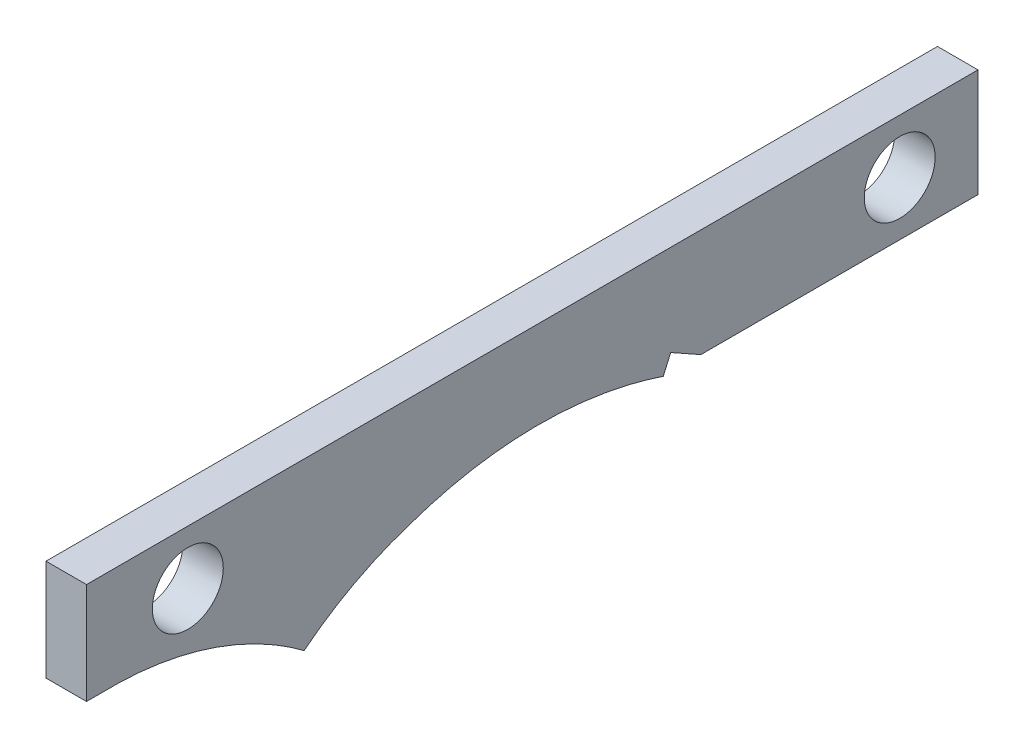
ISO-10303-21;
HEADER;
FILE_DESCRIPTION(('STEP AP214'),'2;1');
FILE_NAME('part.step','',(''),(''),'','','');
FILE_SCHEMA(('AUTOMOTIVE_DESIGN { 1 0 10303 214 1 1 1 1 }'));
ENDSEC;
DATA;
#1=APPLICATION_CONTEXT('core data for automotive mechanical design processes');
#2=APPLICATION_PROTOCOL_DEFINITION('international standard','automotive_design',2000,#1);
#3=PRODUCT_CONTEXT('',#1,'mechanical');
#4=PRODUCT('Part','Part','',(#3));
#5=PRODUCT_RELATED_PRODUCT_CATEGORY('part','',(#4));
#6=PRODUCT_DEFINITION_FORMATION('','',#4);
#7=PRODUCT_DEFINITION_CONTEXT('part definition',#1,'design');
#8=PRODUCT_DEFINITION('design','',#6,#7);
#9=PRODUCT_DEFINITION_SHAPE('','',#8);
#10=(LENGTH_UNIT() NAMED_UNIT(*) SI_UNIT(.MILLI.,.METRE.));
#11=(NAMED_UNIT(*) PLANE_ANGLE_UNIT() SI_UNIT($,.RADIAN.));
#12=(NAMED_UNIT(*) SI_UNIT($,.STERADIAN.) SOLID_ANGLE_UNIT());
#13=UNCERTAINTY_MEASURE_WITH_UNIT(LENGTH_MEASURE(1.E-05),#10,'distance_accuracy_value','');
#14=(GEOMETRIC_REPRESENTATION_CONTEXT(3) GLOBAL_UNCERTAINTY_ASSIGNED_CONTEXT((#13)) GLOBAL_UNIT_ASSIGNED_CONTEXT((#10,
#11,#12)) REPRESENTATION_CONTEXT('',''));
#15=CARTESIAN_POINT('',(0.,0.,0.));
#16=DIRECTION('',(0.,0.,1.));
#17=DIRECTION('',(1.,0.,0.));
#18=AXIS2_PLACEMENT_3D('',#15,#16,#17);
#19=CARTESIAN_POINT('',(-310.5,185.,219.999999999998));
#20=CARTESIAN_POINT('',(-310.5,184.50816695374,204.877009792477));
#21=CARTESIAN_POINT('',(-310.5,175.418459021161,192.780566420039));
#22=CARTESIAN_POINT('',(-316.5,185.,219.999999999998));
#23=CARTESIAN_POINT('',(-316.5,184.50816695374,204.877009792477));
#24=CARTESIAN_POINT('',(-316.5,175.418459021161,192.780566420039));
#25=(BOUNDED_SURFACE() B_SPLINE_SURFACE(1,2,((#19,#20,#21),(#22,#23,#24)),.UNSPECIFIED.,.F.,.F.,
.F.) B_SPLINE_SURFACE_WITH_KNOTS((2,2),(3,3),(0.0626276430115544,0.187882929034663),
(0.0325107499581212,0.644419774946387),
.UNSPECIFIED.) GEOMETRIC_REPRESENTATION_ITEM() RATIONAL_B_SPLINE_SURFACE(((1.,0.953559884501479,
1.),(1.,0.953559884501479,1.))) REPRESENTATION_ITEM('') SURFACE());
#26=CARTESIAN_POINT('',(-310.5,185.,219.999999999998));
#27=CARTESIAN_POINT('',(-310.5,184.50816695374,204.877009792477));
#28=CARTESIAN_POINT('',(-310.5,175.418459021161,192.780566420039));
#29=(BOUNDED_CURVE() B_SPLINE_CURVE(2,(#26,#27,#28),.UNSPECIFIED.,.F.,
.F.) B_SPLINE_CURVE_WITH_KNOTS((3,3),(0.0325107499581212,0.644419774946387),
.UNSPECIFIED.) CURVE() GEOMETRIC_REPRESENTATION_ITEM() RATIONAL_B_SPLINE_CURVE((1.,
0.953559884501481,1.)) REPRESENTATION_ITEM(''));
#30=CARTESIAN_POINT('',(-310.5,185.,219.999999999998));
#31=VERTEX_POINT('',#30);
#32=CARTESIAN_POINT('',(-310.5,175.418459021161,192.780566420039));
#33=VERTEX_POINT('',#32);
#34=EDGE_CURVE('E38',#31,#33,#29,.T.);
#35=CARTESIAN_POINT('',(-310.5,185.,219.999999999998));
#36=CARTESIAN_POINT('',(-316.5,185.,219.999999999998));
#37=(BOUNDED_CURVE() B_SPLINE_CURVE(1,(#35,#36),.UNSPECIFIED.,.F.,
.F.) B_SPLINE_CURVE_WITH_KNOTS((2,2),(-0.1,0.5),
.UNSPECIFIED.) CURVE() GEOMETRIC_REPRESENTATION_ITEM() RATIONAL_B_SPLINE_CURVE((1.,1.)) REPRESENTATION_ITEM(''));
#38=CARTESIAN_POINT('',(-316.5,185.,219.999999999998));
#39=VERTEX_POINT('',#38);
#40=EDGE_CURVE('E11',#31,#39,#37,.T.);
#41=CARTESIAN_POINT('',(-316.5,175.418459021161,192.780566420039));
#42=CARTESIAN_POINT('',(-316.5,184.50816695374,204.877009792477));
#43=CARTESIAN_POINT('',(-316.5,185.,219.999999999998));
#44=(BOUNDED_CURVE() B_SPLINE_CURVE(2,(#41,#42,#43),.UNSPECIFIED.,.F.,
.F.) B_SPLINE_CURVE_WITH_KNOTS((3,3),(-0.644419774946387,-0.0325107499581212),
.UNSPECIFIED.) CURVE() GEOMETRIC_REPRESENTATION_ITEM() RATIONAL_B_SPLINE_CURVE((1.,
0.953559884501481,1.)) REPRESENTATION_ITEM(''));
#45=CARTESIAN_POINT('',(-316.5,175.418459021161,192.780566420039));
#46=VERTEX_POINT('',#45);
#47=EDGE_CURVE('E143',#46,#39,#44,.T.);
#48=CARTESIAN_POINT('',(-310.5,175.418459021161,192.780566420039));
#49=CARTESIAN_POINT('',(-316.5,175.418459021161,192.780566420039));
#50=(BOUNDED_CURVE() B_SPLINE_CURVE(1,(#48,#49),.UNSPECIFIED.,.F.,
.F.) B_SPLINE_CURVE_WITH_KNOTS((2,2),(0.3,0.9),
.UNSPECIFIED.) CURVE() GEOMETRIC_REPRESENTATION_ITEM() RATIONAL_B_SPLINE_CURVE((1.,1.)) REPRESENTATION_ITEM(''));
#51=EDGE_CURVE('E31',#33,#46,#50,.T.);
#52=ORIENTED_EDGE('',*,*,#34,.F.);
#53=ORIENTED_EDGE('',*,*,#40,.T.);
#54=ORIENTED_EDGE('',*,*,#47,.F.);
#55=ORIENTED_EDGE('',*,*,#51,.F.);
#56=EDGE_LOOP('',(#52,#53,#54,#55));
#57=FACE_BOUND('',#56,.T.);
#58=ADVANCED_FACE('F16',(#57),#25,.T.);
#59=CARTESIAN_POINT('',(-316.5,183.736343401191,177.248420365533));
#60=CARTESIAN_POINT('',(-316.5,181.000038118032,185.776353940869));
#61=CARTESIAN_POINT('',(-316.5,175.418459021161,192.780566420039));
#62=CARTESIAN_POINT('',(-310.5,183.736343401191,177.248420365533));
#63=CARTESIAN_POINT('',(-310.5,181.000038118032,185.776353940869));
#64=CARTESIAN_POINT('',(-310.5,175.418459021161,192.780566420039));
#65=(BOUNDED_SURFACE() B_SPLINE_SURFACE(1,2,((#59,#60,#61),(#62,#63,#64)),.UNSPECIFIED.,.F.,.F.,
.F.) B_SPLINE_SURFACE_WITH_KNOTS((2,2),(3,3),(0.,0.122721717320036),(-0.390907154968764,
-0.028552435822604),
.UNSPECIFIED.) GEOMETRIC_REPRESENTATION_ITEM() RATIONAL_B_SPLINE_SURFACE(((1.,0.983632228764717,
1.),(1.,0.983632228764717,1.))) REPRESENTATION_ITEM('') SURFACE());
#66=CARTESIAN_POINT('',(-316.5,183.73634340119,177.248420365535));
#67=CARTESIAN_POINT('',(-316.5,181.000038118031,185.77635394087));
#68=CARTESIAN_POINT('',(-316.5,175.418459021161,192.780566420039));
#69=(BOUNDED_CURVE() B_SPLINE_CURVE(2,(#66,#67,#68),.UNSPECIFIED.,.F.,
.F.) B_SPLINE_CURVE_WITH_KNOTS((3,3),(-0.390907154968713,-0.0285524358226042),
.UNSPECIFIED.) CURVE() GEOMETRIC_REPRESENTATION_ITEM() RATIONAL_B_SPLINE_CURVE((1.,
0.983632228764737,1.)) REPRESENTATION_ITEM(''));
#70=CARTESIAN_POINT('',(-316.5,183.73634340119,177.248420365535));
#71=VERTEX_POINT('',#70);
#72=EDGE_CURVE('E133',#71,#46,#69,.T.);
#73=CARTESIAN_POINT('',(-316.5,183.736343401191,177.248420365533));
#74=CARTESIAN_POINT('',(-310.5,183.736343401191,177.248420365533));
#75=(BOUNDED_CURVE() B_SPLINE_CURVE(1,(#73,#74),.UNSPECIFIED.,.F.,
.F.) B_SPLINE_CURVE_WITH_KNOTS((2,2),(0.,0.6),
.UNSPECIFIED.) CURVE() GEOMETRIC_REPRESENTATION_ITEM() RATIONAL_B_SPLINE_CURVE((1.,1.)) REPRESENTATION_ITEM(''));
#76=CARTESIAN_POINT('',(-310.5,183.736343401191,177.248420365533));
#77=VERTEX_POINT('',#76);
#78=EDGE_CURVE('E145',#71,#77,#75,.T.);
#79=CARTESIAN_POINT('',(-310.5,175.418459021161,192.780566420039));
#80=CARTESIAN_POINT('',(-310.5,181.000038118032,185.776353940869));
#81=CARTESIAN_POINT('',(-310.5,183.736343401191,177.248420365533));
#82=(BOUNDED_CURVE() B_SPLINE_CURVE(2,(#79,#80,#81),.UNSPECIFIED.,.F.,
.F.) B_SPLINE_CURVE_WITH_KNOTS((3,3),(0.0285524358226042,0.390907154968764),
.UNSPECIFIED.) CURVE() GEOMETRIC_REPRESENTATION_ITEM() RATIONAL_B_SPLINE_CURVE((1.,
0.983632228764721,1.)) REPRESENTATION_ITEM(''));
#83=EDGE_CURVE('E126',#33,#77,#82,.T.);
#84=ORIENTED_EDGE('',*,*,#51,.T.);
#85=ORIENTED_EDGE('',*,*,#72,.F.);
#86=ORIENTED_EDGE('',*,*,#78,.T.);
#87=ORIENTED_EDGE('',*,*,#83,.F.);
#88=EDGE_LOOP('',(#84,#85,#86,#87));
#89=FACE_BOUND('',#88,.T.);
#90=ADVANCED_FACE('F147',(#89),#65,.T.);
#91=CARTESIAN_POINT('',(-316.51,185.,219.989999999998));
#92=CARTESIAN_POINT('',(-316.51,185.,225.009999999998));
#93=CARTESIAN_POINT('',(-310.49,185.,219.989999999998));
#94=CARTESIAN_POINT('',(-310.49,185.,225.009999999998));
#95=(BOUNDED_SURFACE() B_SPLINE_SURFACE(1,1,((#91,#92),(#93,#94)),.UNSPECIFIED.,.F.,.F.,
.F.) B_SPLINE_SURFACE_WITH_KNOTS((2,2),(2,2),(-0.001,0.601),(-0.001,0.501),
.UNSPECIFIED.) GEOMETRIC_REPRESENTATION_ITEM() RATIONAL_B_SPLINE_SURFACE(((1.,1.),(1.,1.))) REPRESENTATION_ITEM('') SURFACE());
#96=CARTESIAN_POINT('',(-316.5,185.,219.999999999998));
#97=CARTESIAN_POINT('',(-316.5,185.,224.999999999998));
#98=(BOUNDED_CURVE() B_SPLINE_CURVE(1,(#96,#97),.UNSPECIFIED.,.F.,
.F.) B_SPLINE_CURVE_WITH_KNOTS((2,2),(0.,0.5),
.UNSPECIFIED.) CURVE() GEOMETRIC_REPRESENTATION_ITEM() RATIONAL_B_SPLINE_CURVE((1.,1.)) REPRESENTATION_ITEM(''));
#99=CARTESIAN_POINT('',(-316.5,185.,224.999999999998));
#100=VERTEX_POINT('',#99);
#101=EDGE_CURVE('E172',#39,#100,#98,.T.);
#102=CARTESIAN_POINT('',(-310.5,185.,219.999999999998));
#103=CARTESIAN_POINT('',(-310.5,185.,224.999999999998));
#104=(BOUNDED_CURVE() B_SPLINE_CURVE(1,(#102,#103),.UNSPECIFIED.,.F.,
.F.) B_SPLINE_CURVE_WITH_KNOTS((2,2),(2.99999999999992,3.49999999999992),
.UNSPECIFIED.) CURVE() GEOMETRIC_REPRESENTATION_ITEM() RATIONAL_B_SPLINE_CURVE((1.,1.)) REPRESENTATION_ITEM(''));
#105=CARTESIAN_POINT('',(-310.5,185.,224.999999999998));
#106=VERTEX_POINT('',#105);
#107=EDGE_CURVE('E139',#31,#106,#104,.T.);
#108=CARTESIAN_POINT('',(-316.5,185.,224.999999999998));
#109=CARTESIAN_POINT('',(-310.5,185.,224.999999999998));
#110=(BOUNDED_CURVE() B_SPLINE_CURVE(1,(#108,#109),.UNSPECIFIED.,.F.,
.F.) B_SPLINE_CURVE_WITH_KNOTS((2,2),(-0.25,0.35),
.UNSPECIFIED.) CURVE() GEOMETRIC_REPRESENTATION_ITEM() RATIONAL_B_SPLINE_CURVE((1.,1.)) REPRESENTATION_ITEM(''));
#111=EDGE_CURVE('E240',#100,#106,#110,.T.);
#112=ORIENTED_EDGE('',*,*,#101,.F.);
#113=ORIENTED_EDGE('',*,*,#40,.F.);
#114=ORIENTED_EDGE('',*,*,#107,.T.);
#115=ORIENTED_EDGE('',*,*,#111,.F.);
#116=EDGE_LOOP('',(#112,#113,#114,#115));
#117=FACE_BOUND('',#116,.T.);
#118=ADVANCED_FACE('F410',(#117),#95,.T.);
#119=CARTESIAN_POINT('',(-310.49,184.99,224.999999999998));
#120=CARTESIAN_POINT('',(-316.51,184.99,224.999999999998));
#121=CARTESIAN_POINT('',(-310.49,200.01,224.999999999998));
#122=CARTESIAN_POINT('',(-316.51,200.01,224.999999999998));
#123=(BOUNDED_SURFACE() B_SPLINE_SURFACE(1,1,((#119,#120),(#121,#122)),.UNSPECIFIED.,.F.,.F.,
.F.) B_SPLINE_SURFACE_WITH_KNOTS((2,2),(2,2),(-0.00100000000000044,1.501),(-0.101,0.501),
.UNSPECIFIED.) GEOMETRIC_REPRESENTATION_ITEM() RATIONAL_B_SPLINE_SURFACE(((1.,1.),(1.,1.))) REPRESENTATION_ITEM('') SURFACE());
#124=CARTESIAN_POINT('',(-310.5,185.,224.999999999998));
#125=CARTESIAN_POINT('',(-310.5,200.,224.999999999998));
#126=(BOUNDED_CURVE() B_SPLINE_CURVE(1,(#124,#125),.UNSPECIFIED.,.F.,
.F.) B_SPLINE_CURVE_WITH_KNOTS((2,2),(2.59999999999992,4.09999999999992),
.UNSPECIFIED.) CURVE() GEOMETRIC_REPRESENTATION_ITEM() RATIONAL_B_SPLINE_CURVE((1.,1.)) REPRESENTATION_ITEM(''));
#127=CARTESIAN_POINT('',(-310.5,200.,224.999999999998));
#128=VERTEX_POINT('',#127);
#129=EDGE_CURVE('E231',#106,#128,#126,.T.);
#130=CARTESIAN_POINT('',(-310.5,200.,224.999999999998));
#131=CARTESIAN_POINT('',(-316.5,200.,224.999999999998));
#132=(BOUNDED_CURVE() B_SPLINE_CURVE(1,(#130,#131),.UNSPECIFIED.,.F.,
.F.) B_SPLINE_CURVE_WITH_KNOTS((2,2),(-0.1,0.5),
.UNSPECIFIED.) CURVE() GEOMETRIC_REPRESENTATION_ITEM() RATIONAL_B_SPLINE_CURVE((1.,1.)) REPRESENTATION_ITEM(''));
#133=CARTESIAN_POINT('',(-316.5,200.,224.999999999998));
#134=VERTEX_POINT('',#133);
#135=EDGE_CURVE('E241',#128,#134,#132,.T.);
#136=CARTESIAN_POINT('',(-316.5,200.,224.999999999998));
#137=CARTESIAN_POINT('',(-316.5,185.,224.999999999998));
#138=(BOUNDED_CURVE() B_SPLINE_CURVE(1,(#136,#137),.UNSPECIFIED.,.F.,
.F.) B_SPLINE_CURVE_WITH_KNOTS((2,2),(-4.09999999999992,-2.59999999999992),
.UNSPECIFIED.) CURVE() GEOMETRIC_REPRESENTATION_ITEM() RATIONAL_B_SPLINE_CURVE((1.,1.)) REPRESENTATION_ITEM(''));
#139=EDGE_CURVE('E353',#134,#100,#138,.T.);
#140=ORIENTED_EDGE('',*,*,#111,.T.);
#141=ORIENTED_EDGE('',*,*,#129,.T.);
#142=ORIENTED_EDGE('',*,*,#135,.T.);
#143=ORIENTED_EDGE('',*,*,#139,.T.);
#144=EDGE_LOOP('',(#140,#141,#142,#143));
#145=FACE_BOUND('',#144,.T.);
#146=ADVANCED_FACE('F407',(#145),#123,.T.);
#147=CARTESIAN_POINT('',(-316.5,175.40845902116,225.009999999998));
#148=CARTESIAN_POINT('',(-316.5,175.40845902116,92.9900013881491));
#149=CARTESIAN_POINT('',(-316.5,200.01,225.009999999998));
#150=CARTESIAN_POINT('',(-316.5,200.01,92.9900013881491));
#151=(BOUNDED_SURFACE() B_SPLINE_SURFACE(1,1,((#147,#148),(#149,#150)),.UNSPECIFIED.,.F.,.F.,
.F.) B_SPLINE_SURFACE_WITH_KNOTS((2,2),(2,2),(4.24084590211586,6.70099999999984),
(-6.50099999999984,6.70099986118509),
.UNSPECIFIED.) GEOMETRIC_REPRESENTATION_ITEM() RATIONAL_B_SPLINE_SURFACE(((1.,1.),(1.,1.))) REPRESENTATION_ITEM('') SURFACE());
#152=CARTESIAN_POINT('',(-316.5,200.,93.0000013881491));
#153=CARTESIAN_POINT('',(-316.5,200.,224.999999999998));
#154=(BOUNDED_CURVE() B_SPLINE_CURVE(1,(#152,#153),.UNSPECIFIED.,.F.,
.F.) B_SPLINE_CURVE_WITH_KNOTS((2,2),(-12.6999998611849,0.5),
.UNSPECIFIED.) CURVE() GEOMETRIC_REPRESENTATION_ITEM() RATIONAL_B_SPLINE_CURVE((1.,1.)) REPRESENTATION_ITEM(''));
#155=CARTESIAN_POINT('',(-316.5,200.,93.0000013881491));
#156=VERTEX_POINT('',#155);
#157=EDGE_CURVE('E853',#156,#134,#154,.T.);
#158=CARTESIAN_POINT('',(-316.5,200.,93.0000013881491));
#159=CARTESIAN_POINT('',(-316.5,184.000002920505,93.0000013881491));
#160=(BOUNDED_CURVE() B_SPLINE_CURVE(1,(#158,#159),.UNSPECIFIED.,.F.,
.F.) B_SPLINE_CURVE_WITH_KNOTS((2,2),(-3.69999999999992,-2.10000029205044),
.UNSPECIFIED.) CURVE() GEOMETRIC_REPRESENTATION_ITEM() RATIONAL_B_SPLINE_CURVE((1.,1.)) REPRESENTATION_ITEM(''));
#161=CARTESIAN_POINT('',(-316.5,184.000002920505,93.0000013881491));
#162=VERTEX_POINT('',#161);
#163=EDGE_CURVE('E181',#156,#162,#160,.T.);
#164=CARTESIAN_POINT('',(-316.5,184.000002920505,93.0000013881491));
#165=CARTESIAN_POINT('',(-316.5,184.000002920505,134.029375206115));
#166=(BOUNDED_CURVE() B_SPLINE_CURVE(1,(#164,#165),.UNSPECIFIED.,.F.,
.F.) B_SPLINE_CURVE_WITH_KNOTS((2,2),(-6.30597127861743,-2.20303389682083),
.UNSPECIFIED.) CURVE() GEOMETRIC_REPRESENTATION_ITEM() RATIONAL_B_SPLINE_CURVE((1.,1.)) REPRESENTATION_ITEM(''));
#167=CARTESIAN_POINT('',(-316.5,184.000002920505,134.029375206115));
#168=VERTEX_POINT('',#167);
#169=EDGE_CURVE('E57',#162,#168,#166,.T.);
#170=CARTESIAN_POINT('',(-316.5,184.000002920505,134.029375206115));
#171=CARTESIAN_POINT('',(-316.5,186.499999798834,138.499999679625));
#172=(BOUNDED_CURVE() B_SPLINE_CURVE(1,(#170,#171),.UNSPECIFIED.,.F.,
.F.) B_SPLINE_CURVE_WITH_KNOTS((2,2),(0.111231876302695,0.623447334628603),
.UNSPECIFIED.) CURVE() GEOMETRIC_REPRESENTATION_ITEM() RATIONAL_B_SPLINE_CURVE((1.,1.)) REPRESENTATION_ITEM(''));
#173=CARTESIAN_POINT('',(-316.5,186.499999798834,138.499999679625));
#174=VERTEX_POINT('',#173);
#175=EDGE_CURVE('E67',#168,#174,#172,.T.);
#176=CARTESIAN_POINT('',(-316.5,186.499999798834,138.499999679625));
#177=CARTESIAN_POINT('',(-316.5,184.000002920504,139.600149064627));
#178=(BOUNDED_CURVE() B_SPLINE_CURVE(1,(#176,#177),.UNSPECIFIED.,.F.,
.F.) B_SPLINE_CURVE_WITH_KNOTS((2,2),(-2.88140699886481,-2.60827126226155),
.UNSPECIFIED.) CURVE() GEOMETRIC_REPRESENTATION_ITEM() RATIONAL_B_SPLINE_CURVE((1.,1.)) REPRESENTATION_ITEM(''));
#179=CARTESIAN_POINT('',(-316.5,184.000002920504,139.600149064627));
#180=VERTEX_POINT('',#179);
#181=EDGE_CURVE('E344',#174,#180,#178,.T.);
#182=CARTESIAN_POINT('',(-316.5,184.000002920504,139.600149064627));
#183=CARTESIAN_POINT('',(-316.5,190.383345303281,158.469911966903));
#184=CARTESIAN_POINT('',(-316.5,183.73634340119,177.248420365535));
#185=(BOUNDED_CURVE() B_SPLINE_CURVE(2,(#182,#183,#184),.UNSPECIFIED.,.F.,
.F.) B_SPLINE_CURVE_WITH_KNOTS((3,3),(-0.997873568667045,-0.331467968237713),
.UNSPECIFIED.) CURVE() GEOMETRIC_REPRESENTATION_ITEM() RATIONAL_B_SPLINE_CURVE((1.,
0.944999648008286,1.)) REPRESENTATION_ITEM(''));
#186=EDGE_CURVE('E79',#180,#71,#185,.T.);
#187=CARTESIAN_POINT('',(-316.5,186.750000000002,104.591492462718));
#188=CARTESIAN_POINT('',(-316.5,186.750000000002,99.3414924627182));
#189=CARTESIAN_POINT('',(-316.5,192.000000000002,99.3414924627182));
#190=CARTESIAN_POINT('',(-316.5,197.250000000002,99.3414924627182));
#191=CARTESIAN_POINT('',(-316.5,197.250000000002,104.591492462718));
#192=CARTESIAN_POINT('',(-316.5,197.250000000002,109.841492462718));
#193=CARTESIAN_POINT('',(-316.5,192.000000000002,109.841492462718));
#194=CARTESIAN_POINT('',(-316.5,186.750000000002,109.841492462718));
#195=CARTESIAN_POINT('',(-316.5,186.750000000002,104.591492462718));
#196=(BOUNDED_CURVE() B_SPLINE_CURVE(2,(#187,#188,#189,#190,#191,#192,#193,#194,#195),
.UNSPECIFIED.,.T.,.F.) B_SPLINE_CURVE_WITH_KNOTS((3,2,2,2,3),(-3.14159265358979,
-1.5707963267949,0.,1.5707963267949,3.14159265358979),
.UNSPECIFIED.) CURVE() GEOMETRIC_REPRESENTATION_ITEM() RATIONAL_B_SPLINE_CURVE((1.,
0.707106781186546,1.,0.707106781186547,1.,0.707106781186547,1.,0.707106781186546,1.)) REPRESENTATION_ITEM(''));
#197=CARTESIAN_POINT('',(-316.5,186.750000000002,104.591492462718));
#198=VERTEX_POINT('',#197);
#199=EDGE_CURVE('E88',#198,#198,#196,.T.);
#200=CARTESIAN_POINT('',(-316.5,186.750000000002,210.));
#201=CARTESIAN_POINT('',(-316.5,186.750000000002,204.75));
#202=CARTESIAN_POINT('',(-316.5,192.000000000002,204.75));
#203=CARTESIAN_POINT('',(-316.5,197.250000000002,204.75));
#204=CARTESIAN_POINT('',(-316.5,197.250000000002,210.));
#205=CARTESIAN_POINT('',(-316.5,197.250000000002,215.25));
#206=CARTESIAN_POINT('',(-316.5,192.000000000002,215.25));
#207=CARTESIAN_POINT('',(-316.5,186.750000000002,215.25));
#208=CARTESIAN_POINT('',(-316.5,186.750000000002,210.));
#209=(BOUNDED_CURVE() B_SPLINE_CURVE(2,(#200,#201,#202,#203,#204,#205,#206,#207,#208),
.UNSPECIFIED.,.T.,.F.) B_SPLINE_CURVE_WITH_KNOTS((3,2,2,2,3),(-3.14159265358979,
-1.5707963267949,0.,1.5707963267949,3.14159265358979),
.UNSPECIFIED.) CURVE() GEOMETRIC_REPRESENTATION_ITEM() RATIONAL_B_SPLINE_CURVE((1.,
0.707106781186547,1.,0.707106781186547,1.,0.707106781186547,1.,0.707106781186547,1.)) REPRESENTATION_ITEM(''));
#210=CARTESIAN_POINT('',(-316.5,186.750000000002,210.));
#211=VERTEX_POINT('',#210);
#212=EDGE_CURVE('E162',#211,#211,#209,.T.);
#213=ORIENTED_EDGE('',*,*,#47,.T.);
#214=ORIENTED_EDGE('',*,*,#101,.T.);
#215=ORIENTED_EDGE('',*,*,#139,.F.);
#216=ORIENTED_EDGE('',*,*,#157,.F.);
#217=ORIENTED_EDGE('',*,*,#163,.T.);
#218=ORIENTED_EDGE('',*,*,#169,.T.);
#219=ORIENTED_EDGE('',*,*,#175,.T.);
#220=ORIENTED_EDGE('',*,*,#181,.T.);
#221=ORIENTED_EDGE('',*,*,#186,.T.);
#222=ORIENTED_EDGE('',*,*,#72,.T.);
#223=EDGE_LOOP('',(#213,#214,#215,#216,#217,#218,#219,#220,#221,#222));
#224=FACE_BOUND('',#223,.T.);
#225=ORIENTED_EDGE('',*,*,#199,.T.);
#226=EDGE_LOOP('',(#225));
#227=FACE_BOUND('',#226,.T.);
#228=ORIENTED_EDGE('',*,*,#212,.T.);
#229=EDGE_LOOP('',(#228));
#230=FACE_BOUND('',#229,.T.);
#231=ADVANCED_FACE('F522',(#224,#227,#230),#151,.T.);
#232=CARTESIAN_POINT('',(-316.51,186.504880551334,138.508727695152));
#233=CARTESIAN_POINT('',(-310.49,186.504880551334,138.508727695152));
#234=CARTESIAN_POINT('',(-316.51,183.995122168006,134.020647190588));
#235=CARTESIAN_POINT('',(-310.49,183.995122168006,134.020647190588));
#236=(BOUNDED_SURFACE() B_SPLINE_SURFACE(1,1,((#232,#233),(#234,#235)),.UNSPECIFIED.,.F.,.F.,
.F.) B_SPLINE_SURFACE_WITH_KNOTS((2,2),(2,2),(-0.001,0.513215458325908),(-0.001,0.601),
.UNSPECIFIED.) GEOMETRIC_REPRESENTATION_ITEM() RATIONAL_B_SPLINE_SURFACE(((1.,1.),(1.,1.))) REPRESENTATION_ITEM('') SURFACE());
#237=CARTESIAN_POINT('',(-310.5,184.000002920505,134.029375206116));
#238=CARTESIAN_POINT('',(-316.5,184.000002920505,134.029375206116));
#239=(BOUNDED_CURVE() B_SPLINE_CURVE(1,(#237,#238),.UNSPECIFIED.,.F.,
.F.) B_SPLINE_CURVE_WITH_KNOTS((2,2),(-0.6,0.),
.UNSPECIFIED.) CURVE() GEOMETRIC_REPRESENTATION_ITEM() RATIONAL_B_SPLINE_CURVE((1.,1.)) REPRESENTATION_ITEM(''));
#240=CARTESIAN_POINT('',(-310.5,184.000002920505,134.029375206116));
#241=VERTEX_POINT('',#240);
#242=EDGE_CURVE('E257',#241,#168,#239,.T.);
#243=CARTESIAN_POINT('',(-310.5,186.499999798834,138.499999679625));
#244=CARTESIAN_POINT('',(-310.5,184.000002920505,134.029375206116));
#245=(BOUNDED_CURVE() B_SPLINE_CURVE(1,(#243,#244),.UNSPECIFIED.,.F.,
.F.) B_SPLINE_CURVE_WITH_KNOTS((2,2),(-0.623447334628603,-0.111231876302806),
.UNSPECIFIED.) CURVE() GEOMETRIC_REPRESENTATION_ITEM() RATIONAL_B_SPLINE_CURVE((1.,1.)) REPRESENTATION_ITEM(''));
#246=CARTESIAN_POINT('',(-310.5,186.499999798834,138.499999679625));
#247=VERTEX_POINT('',#246);
#248=EDGE_CURVE('E191',#247,#241,#245,.T.);
#249=CARTESIAN_POINT('',(-316.5,186.499999798834,138.499999679625));
#250=CARTESIAN_POINT('',(-310.5,186.499999798834,138.499999679625));
#251=(BOUNDED_CURVE() B_SPLINE_CURVE(1,(#249,#250),.UNSPECIFIED.,.F.,
.F.) B_SPLINE_CURVE_WITH_KNOTS((2,2),(0.,0.6),
.UNSPECIFIED.) CURVE() GEOMETRIC_REPRESENTATION_ITEM() RATIONAL_B_SPLINE_CURVE((1.,1.)) REPRESENTATION_ITEM(''));
#252=EDGE_CURVE('E250',#174,#247,#251,.T.);
#253=ORIENTED_EDGE('',*,*,#175,.F.);
#254=ORIENTED_EDGE('',*,*,#242,.F.);
#255=ORIENTED_EDGE('',*,*,#248,.F.);
#256=ORIENTED_EDGE('',*,*,#252,.F.);
#257=EDGE_LOOP('',(#253,#254,#255,#256));
#258=FACE_BOUND('',#257,.T.);
#259=ADVANCED_FACE('F526',(#258),#236,.T.);
#260=CARTESIAN_POINT('',(-316.51,183.99084997366,139.604176913193));
#261=CARTESIAN_POINT('',(-310.49,183.99084997366,139.604176913193));
#262=CARTESIAN_POINT('',(-316.51,186.509152745678,138.495971831059));
#263=CARTESIAN_POINT('',(-310.49,186.509152745678,138.495971831059));
#264=(BOUNDED_SURFACE() B_SPLINE_SURFACE(1,1,((#260,#261),(#262,#263)),.UNSPECIFIED.,.F.,.F.,
.F.) B_SPLINE_SURFACE_WITH_KNOTS((2,2),(2,2),(-0.001,0.274135736603299),(-0.001,0.601),
.UNSPECIFIED.) GEOMETRIC_REPRESENTATION_ITEM() RATIONAL_B_SPLINE_SURFACE(((1.,1.),(1.,1.))) REPRESENTATION_ITEM('') SURFACE());
#265=CARTESIAN_POINT('',(-310.5,184.000002920504,139.600149064627));
#266=CARTESIAN_POINT('',(-310.5,186.499999798834,138.499999679625));
#267=(BOUNDED_CURVE() B_SPLINE_CURVE(1,(#265,#266),.UNSPECIFIED.,.F.,
.F.) B_SPLINE_CURVE_WITH_KNOTS((2,2),(2.60827126226151,2.88140699886481),
.UNSPECIFIED.) CURVE() GEOMETRIC_REPRESENTATION_ITEM() RATIONAL_B_SPLINE_CURVE((1.,1.)) REPRESENTATION_ITEM(''));
#268=CARTESIAN_POINT('',(-310.5,184.000002920505,139.600149064631));
#269=VERTEX_POINT('',#268);
#270=EDGE_CURVE('E157',#269,#247,#267,.T.);
#271=CARTESIAN_POINT('',(-310.5,184.000002920505,139.600149064631));
#272=CARTESIAN_POINT('',(-316.5,184.000002920505,139.600149064631));
#273=(BOUNDED_CURVE() B_SPLINE_CURVE(1,(#271,#272),.UNSPECIFIED.,.F.,
.F.) B_SPLINE_CURVE_WITH_KNOTS((2,2),(-0.6,0.),
.UNSPECIFIED.) CURVE() GEOMETRIC_REPRESENTATION_ITEM() RATIONAL_B_SPLINE_CURVE((1.,1.)) REPRESENTATION_ITEM(''));
#274=EDGE_CURVE('E141',#269,#180,#273,.T.);
#275=ORIENTED_EDGE('',*,*,#181,.F.);
#276=ORIENTED_EDGE('',*,*,#252,.T.);
#277=ORIENTED_EDGE('',*,*,#270,.F.);
#278=ORIENTED_EDGE('',*,*,#274,.T.);
#279=EDGE_LOOP('',(#275,#276,#277,#278));
#280=FACE_BOUND('',#279,.T.);
#281=ADVANCED_FACE('F536',(#280),#264,.T.);
#282=CARTESIAN_POINT('',(-316.5,184.000002920504,139.600149064627));
#283=CARTESIAN_POINT('',(-316.5,190.383345303281,158.469911966903));
#284=CARTESIAN_POINT('',(-316.5,183.73634340119,177.248420365535));
#285=CARTESIAN_POINT('',(-310.5,184.000002920504,139.600149064627));
#286=CARTESIAN_POINT('',(-310.5,190.383345303281,158.469911966903));
#287=CARTESIAN_POINT('',(-310.5,183.73634340119,177.248420365535));
#288=(BOUNDED_SURFACE() B_SPLINE_SURFACE(1,2,((#282,#283,#284),(#285,#286,#287)),.UNSPECIFIED.,
.F.,.F.,.F.) B_SPLINE_SURFACE_WITH_KNOTS((2,2),(3,3),(0.,0.104248077538632),(-0.997873568667045,
-0.331467968237713),
.UNSPECIFIED.) GEOMETRIC_REPRESENTATION_ITEM() RATIONAL_B_SPLINE_SURFACE(((1.,0.944999648008289,
1.),(1.,0.944999648008289,1.))) REPRESENTATION_ITEM('') SURFACE());
#289=CARTESIAN_POINT('',(-310.5,183.736343401191,177.248420365533));
#290=CARTESIAN_POINT('',(-310.5,190.38334530328,158.469911966904));
#291=CARTESIAN_POINT('',(-310.5,184.000002920505,139.600149064631));
#292=(BOUNDED_CURVE() B_SPLINE_CURVE(2,(#289,#290,#291),.UNSPECIFIED.,.F.,
.F.) B_SPLINE_CURVE_WITH_KNOTS((3,3),(0.331467968237757,0.997873568666977),
.UNSPECIFIED.) CURVE() GEOMETRIC_REPRESENTATION_ITEM() RATIONAL_B_SPLINE_CURVE((1.,
0.944999648008311,1.)) REPRESENTATION_ITEM(''));
#293=EDGE_CURVE('E150',#77,#269,#292,.T.);
#294=ORIENTED_EDGE('',*,*,#186,.F.);
#295=ORIENTED_EDGE('',*,*,#274,.F.);
#296=ORIENTED_EDGE('',*,*,#293,.F.);
#297=ORIENTED_EDGE('',*,*,#78,.F.);
#298=EDGE_LOOP('',(#294,#295,#296,#297));
#299=FACE_BOUND('',#298,.T.);
#300=ADVANCED_FACE('F546',(#299),#288,.T.);
#301=CARTESIAN_POINT('',(-310.5,200.01,225.009999999998));
#302=CARTESIAN_POINT('',(-310.5,200.01,92.9900013881491));
#303=CARTESIAN_POINT('',(-310.5,175.40845902116,225.009999999998));
#304=CARTESIAN_POINT('',(-310.5,175.40845902116,92.9900013881491));
#305=(BOUNDED_SURFACE() B_SPLINE_SURFACE(1,1,((#301,#302),(#303,#304)),.UNSPECIFIED.,.F.,.F.,
.F.) B_SPLINE_SURFACE_WITH_KNOTS((2,2),(2,2),(4.24084590211586,6.70099999999985),
(-6.50099999999984,6.70099986118509),
.UNSPECIFIED.) GEOMETRIC_REPRESENTATION_ITEM() RATIONAL_B_SPLINE_SURFACE(((1.,1.),(1.,1.))) REPRESENTATION_ITEM('') SURFACE());
#306=CARTESIAN_POINT('',(-310.5,184.000002920505,134.029375206116));
#307=CARTESIAN_POINT('',(-310.5,184.000002920505,93.0000013881491));
#308=(BOUNDED_CURVE() B_SPLINE_CURVE(1,(#306,#307),.UNSPECIFIED.,.F.,
.F.) B_SPLINE_CURVE_WITH_KNOTS((2,2),(2.20303389682073,6.30597127861743),
.UNSPECIFIED.) CURVE() GEOMETRIC_REPRESENTATION_ITEM() RATIONAL_B_SPLINE_CURVE((1.,1.)) REPRESENTATION_ITEM(''));
#309=CARTESIAN_POINT('',(-310.5,184.000002920505,93.0000013881491));
#310=VERTEX_POINT('',#309);
#311=EDGE_CURVE('E182',#241,#310,#308,.T.);
#312=CARTESIAN_POINT('',(-310.5,200.,93.0000013881491));
#313=CARTESIAN_POINT('',(-310.5,184.000002920505,93.0000013881491));
#314=(BOUNDED_CURVE() B_SPLINE_CURVE(1,(#312,#313),.UNSPECIFIED.,.F.,
.F.) B_SPLINE_CURVE_WITH_KNOTS((2,2),(-3.69999999999992,-2.10000029205044),
.UNSPECIFIED.) CURVE() GEOMETRIC_REPRESENTATION_ITEM() RATIONAL_B_SPLINE_CURVE((1.,1.)) REPRESENTATION_ITEM(''));
#315=CARTESIAN_POINT('',(-310.5,200.,93.0000013881491));
#316=VERTEX_POINT('',#315);
#317=EDGE_CURVE('E22',#316,#310,#314,.T.);
#318=CARTESIAN_POINT('',(-310.5,200.,93.0000013881491));
#319=CARTESIAN_POINT('',(-310.5,200.,224.999999999998));
#320=(BOUNDED_CURVE() B_SPLINE_CURVE(1,(#318,#319),.UNSPECIFIED.,.F.,
.F.) B_SPLINE_CURVE_WITH_KNOTS((2,2),(-9.69999986118501,3.49999999999992),
.UNSPECIFIED.) CURVE() GEOMETRIC_REPRESENTATION_ITEM() RATIONAL_B_SPLINE_CURVE((1.,1.)) REPRESENTATION_ITEM(''));
#321=EDGE_CURVE('E192',#316,#128,#320,.T.);
#322=CARTESIAN_POINT('',(-310.5,186.750000000002,210.));
#323=CARTESIAN_POINT('',(-310.5,186.750000000002,215.25));
#324=CARTESIAN_POINT('',(-310.5,192.000000000002,215.25));
#325=CARTESIAN_POINT('',(-310.5,197.250000000002,215.25));
#326=CARTESIAN_POINT('',(-310.5,197.250000000002,210.));
#327=CARTESIAN_POINT('',(-310.5,197.250000000002,204.75));
#328=CARTESIAN_POINT('',(-310.5,192.000000000002,204.75));
#329=CARTESIAN_POINT('',(-310.5,186.750000000002,204.75));
#330=CARTESIAN_POINT('',(-310.5,186.750000000002,210.));
#331=(BOUNDED_CURVE() B_SPLINE_CURVE(2,(#322,#323,#324,#325,#326,#327,#328,#329,#330),
.UNSPECIFIED.,.T.,.F.) B_SPLINE_CURVE_WITH_KNOTS((3,2,2,2,3),(-3.14159265358979,
-1.5707963267949,0.,1.5707963267949,3.14159265358979),
.UNSPECIFIED.) CURVE() GEOMETRIC_REPRESENTATION_ITEM() RATIONAL_B_SPLINE_CURVE((1.,
0.707106781186547,1.,0.707106781186547,1.,0.707106781186547,1.,0.707106781186547,1.)) REPRESENTATION_ITEM(''));
#332=CARTESIAN_POINT('',(-310.5,186.750000000002,210.));
#333=VERTEX_POINT('',#332);
#334=EDGE_CURVE('E266',#333,#333,#331,.T.);
#335=CARTESIAN_POINT('',(-310.5,186.750000000002,104.591492462718));
#336=CARTESIAN_POINT('',(-310.5,186.750000000002,109.841492462718));
#337=CARTESIAN_POINT('',(-310.5,192.000000000002,109.841492462718));
#338=CARTESIAN_POINT('',(-310.5,197.250000000002,109.841492462718));
#339=CARTESIAN_POINT('',(-310.5,197.250000000002,104.591492462718));
#340=CARTESIAN_POINT('',(-310.5,197.250000000002,99.3414924627182));
#341=CARTESIAN_POINT('',(-310.5,192.000000000002,99.3414924627182));
#342=CARTESIAN_POINT('',(-310.5,186.750000000002,99.3414924627182));
#343=CARTESIAN_POINT('',(-310.5,186.750000000002,104.591492462718));
#344=(BOUNDED_CURVE() B_SPLINE_CURVE(2,(#335,#336,#337,#338,#339,#340,#341,#342,#343),
.UNSPECIFIED.,.T.,.F.) B_SPLINE_CURVE_WITH_KNOTS((3,2,2,2,3),(-3.14159265358979,
-1.5707963267949,0.,1.5707963267949,3.14159265358979),
.UNSPECIFIED.) CURVE() GEOMETRIC_REPRESENTATION_ITEM() RATIONAL_B_SPLINE_CURVE((1.,
0.707106781186546,1.,0.707106781186547,1.,0.707106781186547,1.,0.707106781186546,1.)) REPRESENTATION_ITEM(''));
#345=CARTESIAN_POINT('',(-310.5,186.750000000002,104.591492462718));
#346=VERTEX_POINT('',#345);
#347=EDGE_CURVE('E258',#346,#346,#344,.T.);
#348=ORIENTED_EDGE('',*,*,#34,.T.);
#349=ORIENTED_EDGE('',*,*,#83,.T.);
#350=ORIENTED_EDGE('',*,*,#293,.T.);
#351=ORIENTED_EDGE('',*,*,#270,.T.);
#352=ORIENTED_EDGE('',*,*,#248,.T.);
#353=ORIENTED_EDGE('',*,*,#311,.T.);
#354=ORIENTED_EDGE('',*,*,#317,.F.);
#355=ORIENTED_EDGE('',*,*,#321,.T.);
#356=ORIENTED_EDGE('',*,*,#129,.F.);
#357=ORIENTED_EDGE('',*,*,#107,.F.);
#358=EDGE_LOOP('',(#348,#349,#350,#351,#352,#353,#354,#355,#356,#357));
#359=FACE_BOUND('',#358,.T.);
#360=ORIENTED_EDGE('',*,*,#334,.T.);
#361=EDGE_LOOP('',(#360));
#362=FACE_BOUND('',#361,.T.);
#363=ORIENTED_EDGE('',*,*,#347,.T.);
#364=EDGE_LOOP('',(#363));
#365=FACE_BOUND('',#364,.T.);
#366=ADVANCED_FACE('F135',(#359,#362,#365),#305,.T.);
#367=CARTESIAN_POINT('',(-316.51,184.000002920505,134.039375206116));
#368=CARTESIAN_POINT('',(-310.49,184.000002920505,134.039375206116));
#369=CARTESIAN_POINT('',(-316.51,184.000002920505,92.9900013881491));
#370=CARTESIAN_POINT('',(-310.49,184.000002920505,92.9900013881491));
#371=(BOUNDED_SURFACE() B_SPLINE_SURFACE(1,1,((#367,#368),(#369,#370)),.UNSPECIFIED.,.F.,.F.,
.F.) B_SPLINE_SURFACE_WITH_KNOTS((2,2),(2,2),(1.80800531425307,5.91294269604978),(-0.001,0.601),
.UNSPECIFIED.) GEOMETRIC_REPRESENTATION_ITEM() RATIONAL_B_SPLINE_SURFACE(((1.,1.),(1.,1.))) REPRESENTATION_ITEM('') SURFACE());
#372=CARTESIAN_POINT('',(-316.5,184.000002920505,93.0000013881491));
#373=CARTESIAN_POINT('',(-310.5,184.000002920505,93.0000013881491));
#374=(BOUNDED_CURVE() B_SPLINE_CURVE(1,(#372,#373),.UNSPECIFIED.,.F.,
.F.) B_SPLINE_CURVE_WITH_KNOTS((2,2),(-0.125,0.475),
.UNSPECIFIED.) CURVE() GEOMETRIC_REPRESENTATION_ITEM() RATIONAL_B_SPLINE_CURVE((1.,1.)) REPRESENTATION_ITEM(''));
#375=EDGE_CURVE('E202',#162,#310,#374,.T.);
#376=ORIENTED_EDGE('',*,*,#242,.T.);
#377=ORIENTED_EDGE('',*,*,#169,.F.);
#378=ORIENTED_EDGE('',*,*,#375,.T.);
#379=ORIENTED_EDGE('',*,*,#311,.F.);
#380=EDGE_LOOP('',(#376,#377,#378,#379));
#381=FACE_BOUND('',#380,.T.);
#382=ADVANCED_FACE('F571',(#381),#371,.T.);
#383=CARTESIAN_POINT('',(-310.49,200.01,93.0000013881491));
#384=CARTESIAN_POINT('',(-316.51,200.01,93.0000013881491));
#385=CARTESIAN_POINT('',(-310.49,183.990002920505,93.0000013881491));
#386=CARTESIAN_POINT('',(-316.51,183.990002920505,93.0000013881491));
#387=(BOUNDED_SURFACE() B_SPLINE_SURFACE(1,1,((#383,#384),(#385,#386)),.UNSPECIFIED.,.F.,.F.,
.F.) B_SPLINE_SURFACE_WITH_KNOTS((2,2),(2,2),(-0.701,0.900999707949487),(-0.351,0.251),
.UNSPECIFIED.) GEOMETRIC_REPRESENTATION_ITEM() RATIONAL_B_SPLINE_SURFACE(((1.,1.),(1.,1.))) REPRESENTATION_ITEM('') SURFACE());
#388=CARTESIAN_POINT('',(-316.5,200.,93.0000013881491));
#389=CARTESIAN_POINT('',(-310.5,200.,93.0000013881491));
#390=(BOUNDED_CURVE() B_SPLINE_CURVE(1,(#388,#389),.UNSPECIFIED.,.F.,
.F.) B_SPLINE_CURVE_WITH_KNOTS((2,2),(-0.375,0.225),
.UNSPECIFIED.) CURVE() GEOMETRIC_REPRESENTATION_ITEM() RATIONAL_B_SPLINE_CURVE((1.,1.)) REPRESENTATION_ITEM(''));
#391=EDGE_CURVE('E193',#156,#316,#390,.T.);
#392=ORIENTED_EDGE('',*,*,#391,.T.);
#393=ORIENTED_EDGE('',*,*,#317,.T.);
#394=ORIENTED_EDGE('',*,*,#375,.F.);
#395=ORIENTED_EDGE('',*,*,#163,.F.);
#396=EDGE_LOOP('',(#392,#393,#394,#395));
#397=FACE_BOUND('',#396,.T.);
#398=ADVANCED_FACE('F417',(#397),#387,.T.);
#399=CARTESIAN_POINT('',(-310.5,186.750000000002,104.591492462718));
#400=CARTESIAN_POINT('',(-310.5,186.750000000002,109.841492462718));
#401=CARTESIAN_POINT('',(-310.5,192.000000000002,109.841492462718));
#402=CARTESIAN_POINT('',(-310.5,197.250000000002,109.841492462718));
#403=CARTESIAN_POINT('',(-310.5,197.250000000002,104.591492462718));
#404=CARTESIAN_POINT('',(-310.5,197.250000000002,99.3414924627182));
#405=CARTESIAN_POINT('',(-310.5,192.000000000002,99.3414924627182));
#406=CARTESIAN_POINT('',(-310.5,186.750000000002,99.3414924627182));
#407=CARTESIAN_POINT('',(-310.5,186.750000000002,104.591492462718));
#408=CARTESIAN_POINT('',(-316.5,186.750000000002,104.591492462718));
#409=CARTESIAN_POINT('',(-316.5,186.750000000002,109.841492462718));
#410=CARTESIAN_POINT('',(-316.5,192.000000000002,109.841492462718));
#411=CARTESIAN_POINT('',(-316.5,197.250000000002,109.841492462718));
#412=CARTESIAN_POINT('',(-316.5,197.250000000002,104.591492462718));
#413=CARTESIAN_POINT('',(-316.5,197.250000000002,99.3414924627182));
#414=CARTESIAN_POINT('',(-316.5,192.000000000002,99.3414924627182));
#415=CARTESIAN_POINT('',(-316.5,186.750000000002,99.3414924627182));
#416=CARTESIAN_POINT('',(-316.5,186.750000000002,104.591492462718));
#417=(BOUNDED_SURFACE() B_SPLINE_SURFACE(1,2,((#399,#400,#401,#402,#403,#404,#405,#406,#407),
(#408,#409,#410,#411,#412,#413,#414,#415,#416)),.UNSPECIFIED.,.F.,.T.,
.F.) B_SPLINE_SURFACE_WITH_KNOTS((2,2),(3,2,2,2,3),(23.6666666666667,25.),(-3.14159265358979,
-1.5707963267949,0.,1.5707963267949,3.14159265358979),
.UNSPECIFIED.) GEOMETRIC_REPRESENTATION_ITEM() RATIONAL_B_SPLINE_SURFACE(((1.,0.707106781186548,
1.,0.707106781186548,1.,0.707106781186548,1.,0.707106781186548,1.),(1.,0.707106781186548,1.,
0.707106781186548,1.,0.707106781186548,1.,0.707106781186548,1.))) REPRESENTATION_ITEM('') SURFACE());
#418=CARTESIAN_POINT('',(-310.5,186.750000000002,104.591492462718));
#419=CARTESIAN_POINT('',(-316.5,186.750000000002,104.591492462718));
#420=(BOUNDED_CURVE() B_SPLINE_CURVE(1,(#418,#419),.UNSPECIFIED.,.F.,
.F.) B_SPLINE_CURVE_WITH_KNOTS((2,2),(23.6666666666667,25.),
.UNSPECIFIED.) CURVE() GEOMETRIC_REPRESENTATION_ITEM() RATIONAL_B_SPLINE_CURVE((1.,1.)) REPRESENTATION_ITEM(''));
#421=EDGE_CURVE('E203',#346,#198,#420,.T.);
#422=ORIENTED_EDGE('',*,*,#347,.F.);
#423=ORIENTED_EDGE('',*,*,#421,.T.);
#424=ORIENTED_EDGE('',*,*,#199,.F.);
#425=ORIENTED_EDGE('',*,*,#421,.F.);
#426=EDGE_LOOP('',(#422,#423,#424,#425));
#427=FACE_BOUND('',#426,.T.);
#428=ADVANCED_FACE('F511',(#427),#417,.T.);
#429=CARTESIAN_POINT('',(-310.5,186.750000000002,210.));
#430=CARTESIAN_POINT('',(-310.5,186.750000000002,215.25));
#431=CARTESIAN_POINT('',(-310.5,192.000000000002,215.25));
#432=CARTESIAN_POINT('',(-310.5,197.250000000002,215.25));
#433=CARTESIAN_POINT('',(-310.5,197.250000000002,210.));
#434=CARTESIAN_POINT('',(-310.5,197.250000000002,204.75));
#435=CARTESIAN_POINT('',(-310.5,192.000000000002,204.75));
#436=CARTESIAN_POINT('',(-310.5,186.750000000002,204.75));
#437=CARTESIAN_POINT('',(-310.5,186.750000000002,210.));
#438=CARTESIAN_POINT('',(-316.5,186.750000000002,210.));
#439=CARTESIAN_POINT('',(-316.5,186.750000000002,215.25));
#440=CARTESIAN_POINT('',(-316.5,192.000000000002,215.25));
#441=CARTESIAN_POINT('',(-316.5,197.250000000002,215.25));
#442=CARTESIAN_POINT('',(-316.5,197.250000000002,210.));
#443=CARTESIAN_POINT('',(-316.5,197.250000000002,204.75));
#444=CARTESIAN_POINT('',(-316.5,192.000000000002,204.75));
#445=CARTESIAN_POINT('',(-316.5,186.750000000002,204.75));
#446=CARTESIAN_POINT('',(-316.5,186.750000000002,210.));
#447=(BOUNDED_SURFACE() B_SPLINE_SURFACE(1,2,((#429,#430,#431,#432,#433,#434,#435,#436,#437),
(#438,#439,#440,#441,#442,#443,#444,#445,#446)),.UNSPECIFIED.,.F.,.T.,
.F.) B_SPLINE_SURFACE_WITH_KNOTS((2,2),(3,2,2,2,3),(23.6666666666667,25.),(-3.14159265358979,
-1.5707963267949,0.,1.5707963267949,3.14159265358979),
.UNSPECIFIED.) GEOMETRIC_REPRESENTATION_ITEM() RATIONAL_B_SPLINE_SURFACE(((1.,0.707106781186548,
1.,0.707106781186548,1.,0.707106781186548,1.,0.707106781186548,1.),(1.,0.707106781186548,1.,
0.707106781186548,1.,0.707106781186548,1.,0.707106781186548,1.))) REPRESENTATION_ITEM('') SURFACE());
#448=CARTESIAN_POINT('',(-310.5,186.750000000002,210.));
#449=CARTESIAN_POINT('',(-316.5,186.750000000002,210.));
#450=(BOUNDED_CURVE() B_SPLINE_CURVE(1,(#448,#449),.UNSPECIFIED.,.F.,
.F.) B_SPLINE_CURVE_WITH_KNOTS((2,2),(23.6666666666667,25.),
.UNSPECIFIED.) CURVE() GEOMETRIC_REPRESENTATION_ITEM() RATIONAL_B_SPLINE_CURVE((1.,1.)) REPRESENTATION_ITEM(''));
#451=EDGE_CURVE('E211',#333,#211,#450,.T.);
#452=ORIENTED_EDGE('',*,*,#334,.F.);
#453=ORIENTED_EDGE('',*,*,#451,.T.);
#454=ORIENTED_EDGE('',*,*,#212,.F.);
#455=ORIENTED_EDGE('',*,*,#451,.F.);
#456=EDGE_LOOP('',(#452,#453,#454,#455));
#457=FACE_BOUND('',#456,.T.);
#458=ADVANCED_FACE('F515',(#457),#447,.T.);
#459=CARTESIAN_POINT('',(-310.49,200.,225.009999999998));
#460=CARTESIAN_POINT('',(-316.51,200.,225.009999999998));
#461=CARTESIAN_POINT('',(-310.49,200.,92.9900013881491));
#462=CARTESIAN_POINT('',(-316.51,200.,92.9900013881491));
#463=(BOUNDED_SURFACE() B_SPLINE_SURFACE(1,1,((#459,#460),(#461,#462)),.UNSPECIFIED.,.F.,.F.,
.F.) B_SPLINE_SURFACE_WITH_KNOTS((2,2),(2,2),(-0.501,12.7009998611849),(-0.101,0.501),
.UNSPECIFIED.) GEOMETRIC_REPRESENTATION_ITEM() RATIONAL_B_SPLINE_SURFACE(((1.,1.),(1.,1.))) REPRESENTATION_ITEM('') SURFACE());
#464=ORIENTED_EDGE('',*,*,#321,.F.);
#465=ORIENTED_EDGE('',*,*,#391,.F.);
#466=ORIENTED_EDGE('',*,*,#157,.T.);
#467=ORIENTED_EDGE('',*,*,#135,.F.);
#468=EDGE_LOOP('',(#464,#465,#466,#467));
#469=FACE_BOUND('',#468,.T.);
#470=ADVANCED_FACE('F18',(#469),#463,.T.);
#471=CLOSED_SHELL('',(#58,#90,#118,#146,#231,#259,#281,#300,#366,#382,#398,#428,#458,#470));
#472=MANIFOLD_SOLID_BREP('B1',#471);
#473=ADVANCED_BREP_SHAPE_REPRESENTATION('',(#18,#472),#14);
#474=SHAPE_DEFINITION_REPRESENTATION(#9,#473);
ENDSEC;
END-ISO-10303-21;
